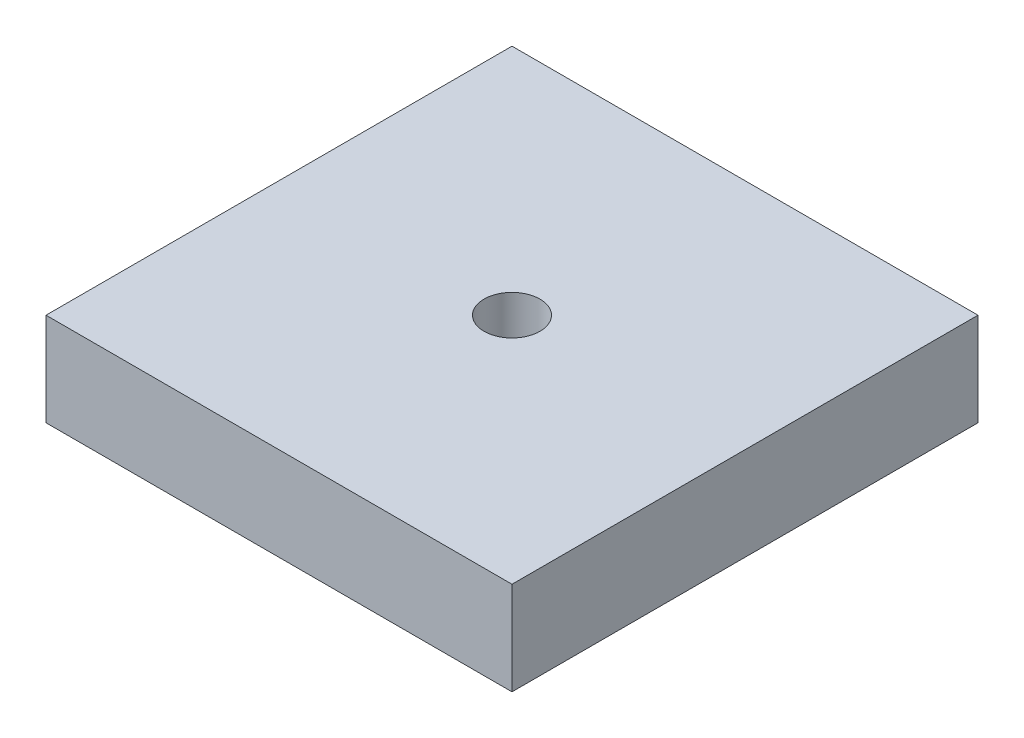
ISO-10303-21;
HEADER;
FILE_DESCRIPTION(('STEP AP214'),'2;1');
FILE_NAME('part.step','',(''),(''),'','','');
FILE_SCHEMA(('AUTOMOTIVE_DESIGN { 1 0 10303 214 1 1 1 1 }'));
ENDSEC;
DATA;
#1=APPLICATION_CONTEXT('core data for automotive mechanical design processes');
#2=APPLICATION_PROTOCOL_DEFINITION('international standard','automotive_design',2000,#1);
#3=PRODUCT_CONTEXT('',#1,'mechanical');
#4=PRODUCT('Part','Part','',(#3));
#5=PRODUCT_RELATED_PRODUCT_CATEGORY('part','',(#4));
#6=PRODUCT_DEFINITION_FORMATION('','',#4);
#7=PRODUCT_DEFINITION_CONTEXT('part definition',#1,'design');
#8=PRODUCT_DEFINITION('design','',#6,#7);
#9=PRODUCT_DEFINITION_SHAPE('','',#8);
#10=(LENGTH_UNIT() NAMED_UNIT(*) SI_UNIT(.MILLI.,.METRE.));
#11=(NAMED_UNIT(*) PLANE_ANGLE_UNIT() SI_UNIT($,.RADIAN.));
#12=(NAMED_UNIT(*) SI_UNIT($,.STERADIAN.) SOLID_ANGLE_UNIT());
#13=UNCERTAINTY_MEASURE_WITH_UNIT(LENGTH_MEASURE(1.E-05),#10,'distance_accuracy_value','');
#14=(GEOMETRIC_REPRESENTATION_CONTEXT(3) GLOBAL_UNCERTAINTY_ASSIGNED_CONTEXT((#13)) GLOBAL_UNIT_ASSIGNED_CONTEXT((#10,
#11,#12)) REPRESENTATION_CONTEXT('',''));
#15=CARTESIAN_POINT('',(0.,0.,0.));
#16=DIRECTION('',(0.,0.,1.));
#17=DIRECTION('',(1.,0.,0.));
#18=AXIS2_PLACEMENT_3D('',#15,#16,#17);
#19=CARTESIAN_POINT('',(0.,620.,0.));
#20=DIRECTION('',(0.,1.,0.));
#21=DIRECTION('',(0.,0.,1.));
#22=AXIS2_PLACEMENT_3D('',#19,#20,#21);
#23=PLANE('',#22);
#24=CARTESIAN_POINT('',(408.3,620.,875.));
#25=DIRECTION('',(0.,1.,0.));
#26=DIRECTION('',(0.,0.,1.));
#27=AXIS2_PLACEMENT_3D('',#24,#25,#26);
#28=CIRCLE('',#27,6.00000000000001);
#29=CARTESIAN_POINT('',(408.3,620.,881.));
#30=VERTEX_POINT('',#29);
#31=EDGE_CURVE('E19',#30,#30,#28,.F.);
#32=ORIENTED_EDGE('',*,*,#31,.T.);
#33=EDGE_LOOP('',(#32));
#34=FACE_BOUND('',#33,.T.);
#35=DIRECTION('',(0.,0.,1.));
#36=VECTOR('',#35,1.);
#37=CARTESIAN_POINT('',(358.3,620.,825.));
#38=LINE('',#37,#36);
#39=CARTESIAN_POINT('',(358.3,620.,925.));
#40=VERTEX_POINT('',#39);
#41=CARTESIAN_POINT('',(358.3,620.,825.));
#42=VERTEX_POINT('',#41);
#43=EDGE_CURVE('E69',#40,#42,#38,.F.);
#44=ORIENTED_EDGE('',*,*,#43,.F.);
#45=DIRECTION('',(1.,0.,0.));
#46=VECTOR('',#45,1.);
#47=CARTESIAN_POINT('',(1175.,620.,925.));
#48=LINE('',#47,#46);
#49=CARTESIAN_POINT('',(458.3,620.,925.));
#50=VERTEX_POINT('',#49);
#51=EDGE_CURVE('E66',#50,#40,#48,.F.);
#52=ORIENTED_EDGE('',*,*,#51,.F.);
#53=DIRECTION('',(0.,0.,-1.));
#54=VECTOR('',#53,1.);
#55=CARTESIAN_POINT('',(458.3,620.,925.));
#56=LINE('',#55,#54);
#57=CARTESIAN_POINT('',(458.3,620.,825.));
#58=VERTEX_POINT('',#57);
#59=EDGE_CURVE('E57',#58,#50,#56,.F.);
#60=ORIENTED_EDGE('',*,*,#59,.F.);
#61=DIRECTION('',(-1.,0.,0.));
#62=VECTOR('',#61,1.);
#63=CARTESIAN_POINT('',(458.3,620.,825.));
#64=LINE('',#63,#62);
#65=EDGE_CURVE('E52',#42,#58,#64,.F.);
#66=ORIENTED_EDGE('',*,*,#65,.F.);
#67=EDGE_LOOP('',(#44,#52,#60,#66));
#68=FACE_BOUND('',#67,.T.);
#69=ADVANCED_FACE('F16',(#34,#68),#23,.T.);
#70=CARTESIAN_POINT('',(1175.,600.,925.));
#71=DIRECTION('',(0.,0.,1.));
#72=DIRECTION('',(1.,0.,0.));
#73=AXIS2_PLACEMENT_3D('',#70,#71,#72);
#74=PLANE('',#73);
#75=DIRECTION('',(1.,0.,0.));
#76=VECTOR('',#75,1.);
#77=CARTESIAN_POINT('',(-1275.,600.,925.));
#78=LINE('',#77,#76);
#79=CARTESIAN_POINT('',(358.3,600.,925.));
#80=VERTEX_POINT('',#79);
#81=CARTESIAN_POINT('',(458.3,600.,925.));
#82=VERTEX_POINT('',#81);
#83=EDGE_CURVE('E76',#80,#82,#78,.T.);
#84=ORIENTED_EDGE('',*,*,#83,.T.);
#85=DIRECTION('',(0.,1.,0.));
#86=VECTOR('',#85,1.);
#87=CARTESIAN_POINT('',(458.3,600.,925.));
#88=LINE('',#87,#86);
#89=EDGE_CURVE('E62',#50,#82,#88,.F.);
#90=ORIENTED_EDGE('',*,*,#89,.F.);
#91=ORIENTED_EDGE('',*,*,#51,.T.);
#92=DIRECTION('',(0.,1.,0.));
#93=VECTOR('',#92,1.);
#94=CARTESIAN_POINT('',(358.3,600.,925.));
#95=LINE('',#94,#93);
#96=EDGE_CURVE('E81',#80,#40,#95,.T.);
#97=ORIENTED_EDGE('',*,*,#96,.F.);
#98=EDGE_LOOP('',(#84,#90,#91,#97));
#99=FACE_BOUND('',#98,.T.);
#100=ADVANCED_FACE('F75',(#99),#74,.T.);
#101=CARTESIAN_POINT('',(458.3,600.,925.));
#102=DIRECTION('',(1.,0.,0.));
#103=DIRECTION('',(0.,0.,-1.));
#104=AXIS2_PLACEMENT_3D('',#101,#102,#103);
#105=PLANE('',#104);
#106=ORIENTED_EDGE('',*,*,#59,.T.);
#107=ORIENTED_EDGE('',*,*,#89,.T.);
#108=DIRECTION('',(0.,0.,1.));
#109=VECTOR('',#108,1.);
#110=CARTESIAN_POINT('',(458.3,600.,50.));
#111=LINE('',#110,#109);
#112=CARTESIAN_POINT('',(458.3,600.,825.));
#113=VERTEX_POINT('',#112);
#114=EDGE_CURVE('E86',#82,#113,#111,.F.);
#115=ORIENTED_EDGE('',*,*,#114,.T.);
#116=DIRECTION('',(0.,1.,0.));
#117=VECTOR('',#116,1.);
#118=CARTESIAN_POINT('',(458.3,600.,825.));
#119=LINE('',#118,#117);
#120=EDGE_CURVE('E64',#58,#113,#119,.F.);
#121=ORIENTED_EDGE('',*,*,#120,.F.);
#122=EDGE_LOOP('',(#106,#107,#115,#121));
#123=FACE_BOUND('',#122,.T.);
#124=ADVANCED_FACE('F59',(#123),#105,.T.);
#125=CARTESIAN_POINT('',(458.3,600.,825.));
#126=DIRECTION('',(0.,0.,-1.));
#127=DIRECTION('',(-1.,0.,0.));
#128=AXIS2_PLACEMENT_3D('',#125,#126,#127);
#129=PLANE('',#128);
#130=ORIENTED_EDGE('',*,*,#65,.T.);
#131=ORIENTED_EDGE('',*,*,#120,.T.);
#132=DIRECTION('',(1.,0.,0.));
#133=VECTOR('',#132,1.);
#134=CARTESIAN_POINT('',(-1275.,600.,825.));
#135=LINE('',#134,#133);
#136=CARTESIAN_POINT('',(358.3,600.,825.));
#137=VERTEX_POINT('',#136);
#138=EDGE_CURVE('E88',#113,#137,#135,.F.);
#139=ORIENTED_EDGE('',*,*,#138,.T.);
#140=DIRECTION('',(0.,1.,0.));
#141=VECTOR('',#140,1.);
#142=CARTESIAN_POINT('',(358.3,600.,825.));
#143=LINE('',#142,#141);
#144=EDGE_CURVE('E33',#42,#137,#143,.F.);
#145=ORIENTED_EDGE('',*,*,#144,.F.);
#146=EDGE_LOOP('',(#130,#131,#139,#145));
#147=FACE_BOUND('',#146,.T.);
#148=ADVANCED_FACE('F95',(#147),#129,.T.);
#149=CARTESIAN_POINT('',(358.3,600.,825.));
#150=DIRECTION('',(-1.,0.,0.));
#151=DIRECTION('',(0.,0.,1.));
#152=AXIS2_PLACEMENT_3D('',#149,#150,#151);
#153=PLANE('',#152);
#154=ORIENTED_EDGE('',*,*,#43,.T.);
#155=ORIENTED_EDGE('',*,*,#144,.T.);
#156=DIRECTION('',(0.,0.,1.));
#157=VECTOR('',#156,1.);
#158=CARTESIAN_POINT('',(358.3,600.,50.));
#159=LINE('',#158,#157);
#160=EDGE_CURVE('E25',#137,#80,#159,.T.);
#161=ORIENTED_EDGE('',*,*,#160,.T.);
#162=ORIENTED_EDGE('',*,*,#96,.T.);
#163=EDGE_LOOP('',(#154,#155,#161,#162));
#164=FACE_BOUND('',#163,.T.);
#165=ADVANCED_FACE('F91',(#164),#153,.T.);
#166=CARTESIAN_POINT('',(408.3,600.,875.));
#167=DIRECTION('',(0.,1.,0.));
#168=DIRECTION('',(0.,0.,1.));
#169=AXIS2_PLACEMENT_3D('',#166,#167,#168);
#170=CYLINDRICAL_SURFACE('',#169,6.00000000000001);
#171=ORIENTED_EDGE('',*,*,#31,.F.);
#172=EDGE_LOOP('',(#171));
#173=FACE_BOUND('',#172,.T.);
#174=CARTESIAN_POINT('',(408.3,600.,875.));
#175=DIRECTION('',(0.,1.,0.));
#176=DIRECTION('',(0.,0.,1.));
#177=AXIS2_PLACEMENT_3D('',#174,#175,#176);
#178=CIRCLE('',#177,6.00000000000001);
#179=CARTESIAN_POINT('',(408.3,600.,881.));
#180=VERTEX_POINT('',#179);
#181=EDGE_CURVE('E11',#180,#180,#178,.F.);
#182=ORIENTED_EDGE('',*,*,#181,.T.);
#183=EDGE_LOOP('',(#182));
#184=FACE_BOUND('',#183,.T.);
#185=ADVANCED_FACE('F103',(#173,#184),#170,.F.);
#186=CARTESIAN_POINT('',(-1275.,600.,50.));
#187=DIRECTION('',(0.,1.,0.));
#188=DIRECTION('',(0.,0.,1.));
#189=AXIS2_PLACEMENT_3D('',#186,#187,#188);
#190=PLANE('',#189);
#191=ORIENTED_EDGE('',*,*,#181,.F.);
#192=EDGE_LOOP('',(#191));
#193=FACE_BOUND('',#192,.T.);
#194=ORIENTED_EDGE('',*,*,#138,.F.);
#195=ORIENTED_EDGE('',*,*,#114,.F.);
#196=ORIENTED_EDGE('',*,*,#83,.F.);
#197=ORIENTED_EDGE('',*,*,#160,.F.);
#198=EDGE_LOOP('',(#194,#195,#196,#197));
#199=FACE_BOUND('',#198,.T.);
#200=ADVANCED_FACE('F94',(#193,#199),#190,.F.);
#201=CLOSED_SHELL('',(#69,#100,#124,#148,#165,#185,#200));
#202=MANIFOLD_SOLID_BREP('B1',#201);
#203=ADVANCED_BREP_SHAPE_REPRESENTATION('',(#18,#202),#14);
#204=SHAPE_DEFINITION_REPRESENTATION(#9,#203);
ENDSEC;
END-ISO-10303-21;
